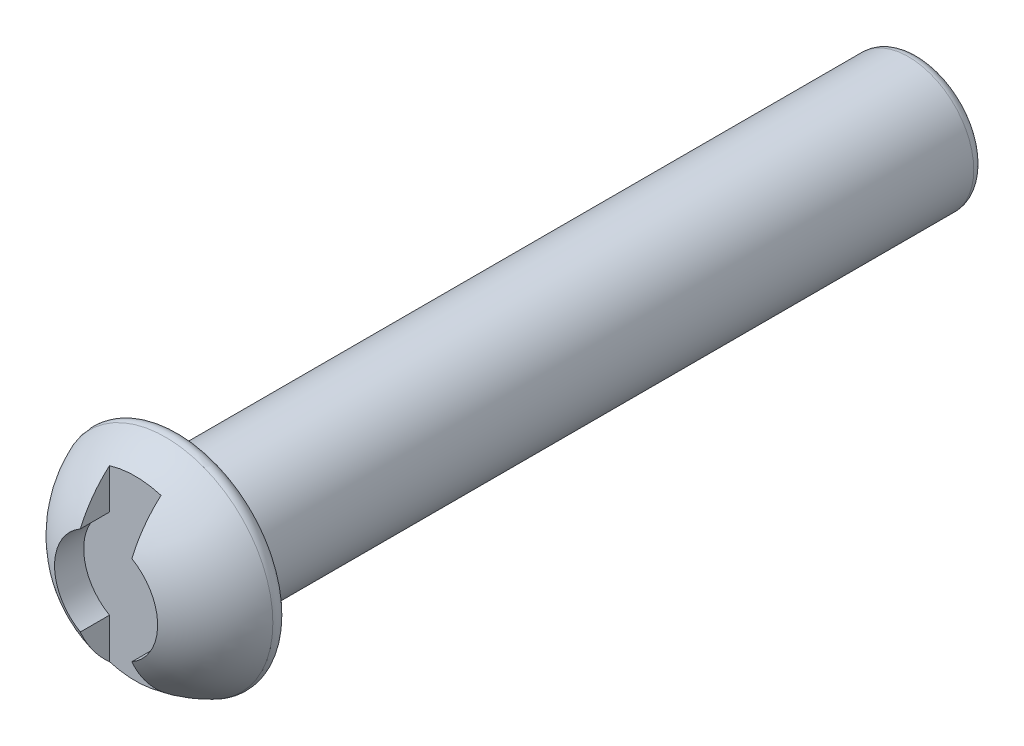
ISO-10303-21;
HEADER;
FILE_DESCRIPTION(('STEP AP214'),'2;1');
FILE_NAME('part.step','',(''),(''),'','','');
FILE_SCHEMA(('AUTOMOTIVE_DESIGN { 1 0 10303 214 1 1 1 1 }'));
ENDSEC;
DATA;
#1=APPLICATION_CONTEXT('core data for automotive mechanical design processes');
#2=APPLICATION_PROTOCOL_DEFINITION('international standard','automotive_design',2000,#1);
#3=PRODUCT_CONTEXT('',#1,'mechanical');
#4=PRODUCT('Part','Part','',(#3));
#5=PRODUCT_RELATED_PRODUCT_CATEGORY('part','',(#4));
#6=PRODUCT_DEFINITION_FORMATION('','',#4);
#7=PRODUCT_DEFINITION_CONTEXT('part definition',#1,'design');
#8=PRODUCT_DEFINITION('design','',#6,#7);
#9=PRODUCT_DEFINITION_SHAPE('','',#8);
#10=(LENGTH_UNIT() NAMED_UNIT(*) SI_UNIT(.MILLI.,.METRE.));
#11=(NAMED_UNIT(*) PLANE_ANGLE_UNIT() SI_UNIT($,.RADIAN.));
#12=(NAMED_UNIT(*) SI_UNIT($,.STERADIAN.) SOLID_ANGLE_UNIT());
#13=UNCERTAINTY_MEASURE_WITH_UNIT(LENGTH_MEASURE(1.E-05),#10,'distance_accuracy_value','');
#14=(GEOMETRIC_REPRESENTATION_CONTEXT(3) GLOBAL_UNCERTAINTY_ASSIGNED_CONTEXT((#13)) GLOBAL_UNIT_ASSIGNED_CONTEXT((#10,
#11,#12)) REPRESENTATION_CONTEXT('',''));
#15=CARTESIAN_POINT('',(0.,0.,0.));
#16=DIRECTION('',(0.,0.,1.));
#17=DIRECTION('',(1.,0.,0.));
#18=AXIS2_PLACEMENT_3D('',#15,#16,#17);
#19=CARTESIAN_POINT('',(0.,0.,-1.68776));
#20=DIRECTION('',(0.,0.,1.));
#21=DIRECTION('',(0.,1.,0.));
#22=AXIS2_PLACEMENT_3D('',#19,#20,#21);
#23=SPHERICAL_SURFACE('',#22,1.68776);
#24=CARTESIAN_POINT('',(0.,0.,-1.04266725626886));
#25=DIRECTION('',(0.,0.,-1.));
#26=DIRECTION('',(-1.,0.,0.));
#27=AXIS2_PLACEMENT_3D('',#24,#25,#26);
#28=CIRCLE('',#27,1.55961186504381);
#29=CARTESIAN_POINT('',(-1.55961186504381,0.,-1.04266725626886));
#30=VERTEX_POINT('',#29);
#31=EDGE_CURVE('E166',#30,#30,#28,.F.);
#32=ORIENTED_EDGE('',*,*,#31,.T.);
#33=EDGE_LOOP('',(#32));
#34=FACE_BOUND('',#33,.T.);
#35=CARTESIAN_POINT('',(-0.375,0.,-1.68776));
#36=DIRECTION('',(-1.,0.,0.));
#37=DIRECTION('',(0.,-1.,0.));
#38=AXIS2_PLACEMENT_3D('',#35,#36,#37);
#39=CIRCLE('',#38,1.64557248931793);
#40=CARTESIAN_POINT('',(-0.375,-1.2347821670238,-0.6));
#41=VERTEX_POINT('',#40);
#42=CARTESIAN_POINT('',(-0.375,-0.649519052838329,-0.175796436417861));
#43=VERTEX_POINT('',#42);
#44=EDGE_CURVE('E156',#41,#43,#39,.T.);
#45=ORIENTED_EDGE('',*,*,#44,.T.);
#46=CARTESIAN_POINT('',(0.,0.,-0.175796436417861));
#47=DIRECTION('',(0.,0.,-1.));
#48=DIRECTION('',(-1.,0.,0.));
#49=AXIS2_PLACEMENT_3D('',#46,#47,#48);
#50=CIRCLE('',#49,0.75);
#51=CARTESIAN_POINT('',(-0.375,0.64951905283833,-0.175796436417862));
#52=VERTEX_POINT('',#51);
#53=EDGE_CURVE('E63',#43,#52,#50,.T.);
#54=ORIENTED_EDGE('',*,*,#53,.T.);
#55=CARTESIAN_POINT('',(-0.375,0.,-1.68776));
#56=DIRECTION('',(-1.,0.,0.));
#57=DIRECTION('',(0.,-1.,0.));
#58=AXIS2_PLACEMENT_3D('',#55,#56,#57);
#59=CIRCLE('',#58,1.64557248931793);
#60=CARTESIAN_POINT('',(-0.375,1.2347821670238,-0.6));
#61=VERTEX_POINT('',#60);
#62=EDGE_CURVE('E160',#52,#61,#59,.T.);
#63=ORIENTED_EDGE('',*,*,#62,.T.);
#64=CARTESIAN_POINT('',(0.,0.,-0.6));
#65=DIRECTION('',(0.,0.,1.));
#66=DIRECTION('',(1.,0.,0.));
#67=AXIS2_PLACEMENT_3D('',#64,#65,#66);
#68=CIRCLE('',#67,1.29046968193755);
#69=CARTESIAN_POINT('',(0.375,1.2347821670238,-0.6));
#70=VERTEX_POINT('',#69);
#71=EDGE_CURVE('E146',#70,#61,#68,.T.);
#72=ORIENTED_EDGE('',*,*,#71,.F.);
#73=CARTESIAN_POINT('',(0.375,0.,-1.68776));
#74=DIRECTION('',(1.,0.,0.));
#75=DIRECTION('',(0.,1.,0.));
#76=AXIS2_PLACEMENT_3D('',#73,#74,#75);
#77=CIRCLE('',#76,1.64557248931793);
#78=CARTESIAN_POINT('',(0.375,0.64951905283833,-0.175796436417861));
#79=VERTEX_POINT('',#78);
#80=EDGE_CURVE('E152',#70,#79,#77,.T.);
#81=ORIENTED_EDGE('',*,*,#80,.T.);
#82=CARTESIAN_POINT('',(0.,0.,-0.175796436417861));
#83=DIRECTION('',(0.,0.,-1.));
#84=DIRECTION('',(-1.,0.,0.));
#85=AXIS2_PLACEMENT_3D('',#82,#83,#84);
#86=CIRCLE('',#85,0.75);
#87=CARTESIAN_POINT('',(0.375,-0.649519052838329,-0.175796436417861));
#88=VERTEX_POINT('',#87);
#89=EDGE_CURVE('E149',#79,#88,#86,.T.);
#90=ORIENTED_EDGE('',*,*,#89,.T.);
#91=CARTESIAN_POINT('',(0.375,0.,-1.68776));
#92=DIRECTION('',(1.,0.,0.));
#93=DIRECTION('',(0.,1.,0.));
#94=AXIS2_PLACEMENT_3D('',#91,#92,#93);
#95=CIRCLE('',#94,1.64557248931793);
#96=CARTESIAN_POINT('',(0.375,-1.2347821670238,-0.6));
#97=VERTEX_POINT('',#96);
#98=EDGE_CURVE('E109',#88,#97,#95,.T.);
#99=ORIENTED_EDGE('',*,*,#98,.T.);
#100=EDGE_CURVE('E101',#41,#97,#68,.T.);
#101=ORIENTED_EDGE('',*,*,#100,.F.);
#102=EDGE_LOOP('',(#45,#54,#63,#72,#81,#90,#99,#101));
#103=FACE_BOUND('',#102,.T.);
#104=ADVANCED_FACE('F39',(#34,#103),#23,.T.);
#105=CARTESIAN_POINT('',(0.,0.,-12.));
#106=DIRECTION('',(0.,0.,1.));
#107=DIRECTION('',(1.,0.,0.));
#108=AXIS2_PLACEMENT_3D('',#105,#106,#107);
#109=PLANE('',#108);
#110=CARTESIAN_POINT('',(0.,0.,-12.));
#111=DIRECTION('',(0.,0.,1.));
#112=DIRECTION('',(1.,0.,0.));
#113=AXIS2_PLACEMENT_3D('',#110,#111,#112);
#114=CIRCLE('',#113,0.799999999999999);
#115=CARTESIAN_POINT('',(0.799999999999999,0.,-12.));
#116=VERTEX_POINT('',#115);
#117=EDGE_CURVE('E11',#116,#116,#114,.F.);
#118=ORIENTED_EDGE('',*,*,#117,.T.);
#119=EDGE_LOOP('',(#118));
#120=FACE_BOUND('',#119,.T.);
#121=ADVANCED_FACE('F189',(#120),#109,.F.);
#122=CARTESIAN_POINT('',(0.,0.,0.));
#123=DIRECTION('',(0.,0.,1.));
#124=DIRECTION('',(1.,0.,0.));
#125=AXIS2_PLACEMENT_3D('',#122,#123,#124);
#126=CYLINDRICAL_SURFACE('',#125,0.949999999999999);
#127=CARTESIAN_POINT('',(0.,0.,-11.85));
#128=DIRECTION('',(0.,0.,1.));
#129=DIRECTION('',(1.,0.,0.));
#130=AXIS2_PLACEMENT_3D('',#127,#128,#129);
#131=CIRCLE('',#130,0.949999999999999);
#132=CARTESIAN_POINT('',(0.949999999999999,0.,-11.85));
#133=VERTEX_POINT('',#132);
#134=EDGE_CURVE('E48',#133,#133,#131,.T.);
#135=ORIENTED_EDGE('',*,*,#134,.T.);
#136=EDGE_LOOP('',(#135));
#137=FACE_BOUND('',#136,.T.);
#138=CARTESIAN_POINT('',(0.,0.,-1.25));
#139=DIRECTION('',(0.,0.,1.));
#140=DIRECTION('',(1.,0.,0.));
#141=AXIS2_PLACEMENT_3D('',#138,#139,#140);
#142=CIRCLE('',#141,0.949999999999999);
#143=CARTESIAN_POINT('',(0.949999999999999,0.,-1.25));
#144=VERTEX_POINT('',#143);
#145=EDGE_CURVE('E135',#144,#144,#142,.T.);
#146=ORIENTED_EDGE('',*,*,#145,.F.);
#147=EDGE_LOOP('',(#146));
#148=FACE_BOUND('',#147,.T.);
#149=ADVANCED_FACE('F177',(#137,#148),#126,.T.);
#150=CARTESIAN_POINT('',(0.,1.63,-1.25));
#151=DIRECTION('',(0.,0.,1.));
#152=DIRECTION('',(1.,0.,0.));
#153=AXIS2_PLACEMENT_3D('',#150,#151,#152);
#154=PLANE('',#153);
#155=CARTESIAN_POINT('',(0.,0.,-1.25));
#156=DIRECTION('',(0.,0.,1.));
#157=DIRECTION('',(1.,0.,0.));
#158=AXIS2_PLACEMENT_3D('',#155,#156,#157);
#159=CIRCLE('',#158,1.42100105559426);
#160=CARTESIAN_POINT('',(1.42100105559426,0.,-1.25));
#161=VERTEX_POINT('',#160);
#162=EDGE_CURVE('E170',#161,#161,#159,.F.);
#163=ORIENTED_EDGE('',*,*,#162,.T.);
#164=EDGE_LOOP('',(#163));
#165=FACE_BOUND('',#164,.T.);
#166=ORIENTED_EDGE('',*,*,#145,.T.);
#167=EDGE_LOOP('',(#166));
#168=FACE_BOUND('',#167,.T.);
#169=ADVANCED_FACE('F201',(#165,#168),#154,.F.);
#170=CARTESIAN_POINT('',(-0.375,-0.649519052838329,-0.6));
#171=DIRECTION('',(-1.,0.,0.));
#172=DIRECTION('',(0.,-1.,0.));
#173=AXIS2_PLACEMENT_3D('',#170,#171,#172);
#174=PLANE('',#173);
#175=DIRECTION('',(0.,-1.,0.));
#176=VECTOR('',#175,1.);
#177=CARTESIAN_POINT('',(-0.375,-0.649519052838329,-0.6));
#178=LINE('',#177,#176);
#179=CARTESIAN_POINT('',(-0.375,-0.649519052838329,-0.6));
#180=VERTEX_POINT('',#179);
#181=EDGE_CURVE('E55',#180,#41,#178,.T.);
#182=ORIENTED_EDGE('',*,*,#181,.F.);
#183=DIRECTION('',(0.,0.,1.));
#184=VECTOR('',#183,1.);
#185=CARTESIAN_POINT('',(-0.375,-0.649519052838329,-0.6));
#186=LINE('',#185,#184);
#187=EDGE_CURVE('E132',#180,#43,#186,.T.);
#188=ORIENTED_EDGE('',*,*,#187,.T.);
#189=ORIENTED_EDGE('',*,*,#44,.F.);
#190=EDGE_LOOP('',(#182,#188,#189));
#191=FACE_BOUND('',#190,.T.);
#192=ADVANCED_FACE('F204',(#191),#174,.F.);
#193=CARTESIAN_POINT('',(0.,0.,-0.6));
#194=DIRECTION('',(0.,0.,1.));
#195=DIRECTION('',(1.,0.,0.));
#196=AXIS2_PLACEMENT_3D('',#193,#194,#195);
#197=CYLINDRICAL_SURFACE('',#196,0.75);
#198=ORIENTED_EDGE('',*,*,#187,.F.);
#199=CARTESIAN_POINT('',(0.,0.,-0.6));
#200=DIRECTION('',(0.,0.,1.));
#201=DIRECTION('',(1.,0.,0.));
#202=AXIS2_PLACEMENT_3D('',#199,#200,#201);
#203=CIRCLE('',#202,0.75);
#204=CARTESIAN_POINT('',(-0.375,0.64951905283833,-0.6));
#205=VERTEX_POINT('',#204);
#206=EDGE_CURVE('E127',#205,#180,#203,.T.);
#207=ORIENTED_EDGE('',*,*,#206,.F.);
#208=DIRECTION('',(0.,0.,1.));
#209=VECTOR('',#208,1.);
#210=CARTESIAN_POINT('',(-0.375,0.64951905283833,-0.6));
#211=LINE('',#210,#209);
#212=EDGE_CURVE('E136',#205,#52,#211,.T.);
#213=ORIENTED_EDGE('',*,*,#212,.T.);
#214=ORIENTED_EDGE('',*,*,#53,.F.);
#215=EDGE_LOOP('',(#198,#207,#213,#214));
#216=FACE_BOUND('',#215,.T.);
#217=ADVANCED_FACE('F217',(#216),#197,.F.);
#218=CARTESIAN_POINT('',(-0.375,1.87097888013581,-0.6));
#219=DIRECTION('',(-1.,0.,0.));
#220=DIRECTION('',(0.,-1.,0.));
#221=AXIS2_PLACEMENT_3D('',#218,#219,#220);
#222=PLANE('',#221);
#223=ORIENTED_EDGE('',*,*,#212,.F.);
#224=DIRECTION('',(0.,-1.,0.));
#225=VECTOR('',#224,1.);
#226=CARTESIAN_POINT('',(-0.375,1.87097888013581,-0.6));
#227=LINE('',#226,#225);
#228=EDGE_CURVE('E122',#61,#205,#227,.T.);
#229=ORIENTED_EDGE('',*,*,#228,.F.);
#230=ORIENTED_EDGE('',*,*,#62,.F.);
#231=EDGE_LOOP('',(#223,#229,#230));
#232=FACE_BOUND('',#231,.T.);
#233=ADVANCED_FACE('F213',(#232),#222,.F.);
#234=CARTESIAN_POINT('',(0.375,1.87097888013581,-0.6));
#235=DIRECTION('',(1.,0.,0.));
#236=DIRECTION('',(0.,1.,0.));
#237=AXIS2_PLACEMENT_3D('',#234,#235,#236);
#238=PLANE('',#237);
#239=DIRECTION('',(0.,1.,0.));
#240=VECTOR('',#239,1.);
#241=CARTESIAN_POINT('',(0.375,1.87097888013581,-0.6));
#242=LINE('',#241,#240);
#243=CARTESIAN_POINT('',(0.375,0.64951905283833,-0.6));
#244=VERTEX_POINT('',#243);
#245=EDGE_CURVE('E119',#244,#70,#242,.T.);
#246=ORIENTED_EDGE('',*,*,#245,.F.);
#247=DIRECTION('',(0.,0.,1.));
#248=VECTOR('',#247,1.);
#249=CARTESIAN_POINT('',(0.375,0.64951905283833,-0.6));
#250=LINE('',#249,#248);
#251=EDGE_CURVE('E113',#244,#79,#250,.T.);
#252=ORIENTED_EDGE('',*,*,#251,.T.);
#253=ORIENTED_EDGE('',*,*,#80,.F.);
#254=EDGE_LOOP('',(#246,#252,#253));
#255=FACE_BOUND('',#254,.T.);
#256=ADVANCED_FACE('F210',(#255),#238,.F.);
#257=CARTESIAN_POINT('',(0.,0.,-0.6));
#258=DIRECTION('',(0.,0.,1.));
#259=DIRECTION('',(1.,0.,0.));
#260=AXIS2_PLACEMENT_3D('',#257,#258,#259);
#261=CYLINDRICAL_SURFACE('',#260,0.75);
#262=ORIENTED_EDGE('',*,*,#251,.F.);
#263=CARTESIAN_POINT('',(0.,0.,-0.6));
#264=DIRECTION('',(0.,0.,1.));
#265=DIRECTION('',(1.,0.,0.));
#266=AXIS2_PLACEMENT_3D('',#263,#264,#265);
#267=CIRCLE('',#266,0.75);
#268=CARTESIAN_POINT('',(0.375,-0.649519052838329,-0.6));
#269=VERTEX_POINT('',#268);
#270=EDGE_CURVE('E99',#269,#244,#267,.T.);
#271=ORIENTED_EDGE('',*,*,#270,.F.);
#272=DIRECTION('',(0.,0.,1.));
#273=VECTOR('',#272,1.);
#274=CARTESIAN_POINT('',(0.375,-0.649519052838329,-0.6));
#275=LINE('',#274,#273);
#276=EDGE_CURVE('E107',#269,#88,#275,.T.);
#277=ORIENTED_EDGE('',*,*,#276,.T.);
#278=ORIENTED_EDGE('',*,*,#89,.F.);
#279=EDGE_LOOP('',(#262,#271,#277,#278));
#280=FACE_BOUND('',#279,.T.);
#281=ADVANCED_FACE('F115',(#280),#261,.F.);
#282=CARTESIAN_POINT('',(0.375,-0.649519052838329,-0.6));
#283=DIRECTION('',(1.,0.,0.));
#284=DIRECTION('',(0.,1.,0.));
#285=AXIS2_PLACEMENT_3D('',#282,#283,#284);
#286=PLANE('',#285);
#287=ORIENTED_EDGE('',*,*,#276,.F.);
#288=DIRECTION('',(0.,1.,0.));
#289=VECTOR('',#288,1.);
#290=CARTESIAN_POINT('',(0.375,-0.649519052838329,-0.6));
#291=LINE('',#290,#289);
#292=EDGE_CURVE('E94',#97,#269,#291,.T.);
#293=ORIENTED_EDGE('',*,*,#292,.F.);
#294=ORIENTED_EDGE('',*,*,#98,.F.);
#295=EDGE_LOOP('',(#287,#293,#294));
#296=FACE_BOUND('',#295,.T.);
#297=ADVANCED_FACE('F108',(#296),#286,.F.);
#298=CARTESIAN_POINT('',(0.,0.,-0.6));
#299=DIRECTION('',(0.,0.,1.));
#300=DIRECTION('',(1.,0.,0.));
#301=AXIS2_PLACEMENT_3D('',#298,#299,#300);
#302=PLANE('',#301);
#303=ORIENTED_EDGE('',*,*,#71,.T.);
#304=ORIENTED_EDGE('',*,*,#228,.T.);
#305=ORIENTED_EDGE('',*,*,#206,.T.);
#306=ORIENTED_EDGE('',*,*,#181,.T.);
#307=ORIENTED_EDGE('',*,*,#100,.T.);
#308=ORIENTED_EDGE('',*,*,#292,.T.);
#309=ORIENTED_EDGE('',*,*,#270,.T.);
#310=ORIENTED_EDGE('',*,*,#245,.T.);
#311=EDGE_LOOP('',(#303,#304,#305,#306,#307,#308,#309,#310));
#312=FACE_BOUND('',#311,.T.);
#313=ADVANCED_FACE('F96',(#312),#302,.T.);
#314=CARTESIAN_POINT('',(0.,0.,-1.1));
#315=DIRECTION('',(0.,0.,1.));
#316=DIRECTION('',(1.,0.,0.));
#317=AXIS2_PLACEMENT_3D('',#314,#315,#316);
#318=TOROIDAL_SURFACE('',#317,1.42100105559426,0.15);
#319=ORIENTED_EDGE('',*,*,#162,.F.);
#320=EDGE_LOOP('',(#319));
#321=FACE_BOUND('',#320,.T.);
#322=ORIENTED_EDGE('',*,*,#31,.F.);
#323=EDGE_LOOP('',(#322));
#324=FACE_BOUND('',#323,.T.);
#325=ADVANCED_FACE('F181',(#321,#324),#318,.T.);
#326=CARTESIAN_POINT('',(0.,0.,-11.85));
#327=DIRECTION('',(0.,0.,1.));
#328=DIRECTION('',(1.,0.,0.));
#329=AXIS2_PLACEMENT_3D('',#326,#327,#328);
#330=TOROIDAL_SURFACE('',#329,0.799999999999999,0.15);
#331=ORIENTED_EDGE('',*,*,#117,.F.);
#332=EDGE_LOOP('',(#331));
#333=FACE_BOUND('',#332,.T.);
#334=ORIENTED_EDGE('',*,*,#134,.F.);
#335=EDGE_LOOP('',(#334));
#336=FACE_BOUND('',#335,.T.);
#337=ADVANCED_FACE('F41',(#333,#336),#330,.T.);
#338=CLOSED_SHELL('',(#104,#121,#149,#169,#192,#217,#233,#256,#281,#297,#313,#325,#337));
#339=MANIFOLD_SOLID_BREP('B2',#338);
#340=ADVANCED_BREP_SHAPE_REPRESENTATION('',(#18,#339),#14);
#341=SHAPE_DEFINITION_REPRESENTATION(#9,#340);
ENDSEC;
END-ISO-10303-21;
